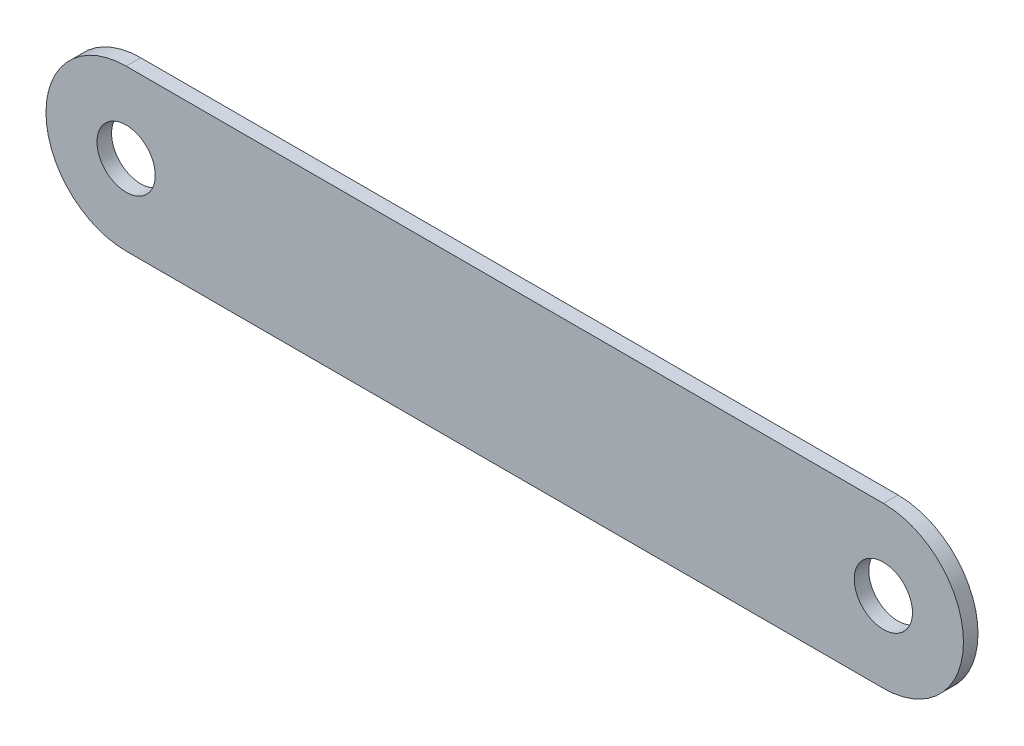
ISO-10303-21;
HEADER;
FILE_DESCRIPTION(('STEP AP214'),'2;1');
FILE_NAME('part.step','',(''),(''),'','','');
FILE_SCHEMA(('AUTOMOTIVE_DESIGN { 1 0 10303 214 1 1 1 1 }'));
ENDSEC;
DATA;
#1=APPLICATION_CONTEXT('core data for automotive mechanical design processes');
#2=APPLICATION_PROTOCOL_DEFINITION('international standard','automotive_design',2000,#1);
#3=PRODUCT_CONTEXT('',#1,'mechanical');
#4=PRODUCT('Part','Part','',(#3));
#5=PRODUCT_RELATED_PRODUCT_CATEGORY('part','',(#4));
#6=PRODUCT_DEFINITION_FORMATION('','',#4);
#7=PRODUCT_DEFINITION_CONTEXT('part definition',#1,'design');
#8=PRODUCT_DEFINITION('design','',#6,#7);
#9=PRODUCT_DEFINITION_SHAPE('','',#8);
#10=(LENGTH_UNIT() NAMED_UNIT(*) SI_UNIT(.MILLI.,.METRE.));
#11=(NAMED_UNIT(*) PLANE_ANGLE_UNIT() SI_UNIT($,.RADIAN.));
#12=(NAMED_UNIT(*) SI_UNIT($,.STERADIAN.) SOLID_ANGLE_UNIT());
#13=UNCERTAINTY_MEASURE_WITH_UNIT(LENGTH_MEASURE(1.E-05),#10,'distance_accuracy_value','');
#14=(GEOMETRIC_REPRESENTATION_CONTEXT(3) GLOBAL_UNCERTAINTY_ASSIGNED_CONTEXT((#13)) GLOBAL_UNIT_ASSIGNED_CONTEXT((#10,
#11,#12)) REPRESENTATION_CONTEXT('',''));
#15=CARTESIAN_POINT('',(0.,0.,0.));
#16=DIRECTION('',(0.,0.,1.));
#17=DIRECTION('',(1.,0.,0.));
#18=AXIS2_PLACEMENT_3D('',#15,#16,#17);
#19=CARTESIAN_POINT('',(0.,0.,1.));
#20=DIRECTION('',(0.,0.,1.));
#21=DIRECTION('',(1.,0.,0.));
#22=AXIS2_PLACEMENT_3D('',#19,#20,#21);
#23=PLANE('',#22);
#24=CARTESIAN_POINT('',(52.,0.,1.));
#25=DIRECTION('',(0.,0.,1.));
#26=DIRECTION('',(1.,0.,0.));
#27=AXIS2_PLACEMENT_3D('',#24,#25,#26);
#28=CIRCLE('',#27,2.);
#29=CARTESIAN_POINT('',(54.,0.,1.));
#30=VERTEX_POINT('',#29);
#31=EDGE_CURVE('E94',#30,#30,#28,.T.);
#32=ORIENTED_EDGE('',*,*,#31,.F.);
#33=EDGE_LOOP('',(#32));
#34=FACE_BOUND('',#33,.T.);
#35=CARTESIAN_POINT('',(0.,0.,1.));
#36=DIRECTION('',(0.,0.,1.));
#37=DIRECTION('',(1.,0.,0.));
#38=AXIS2_PLACEMENT_3D('',#35,#36,#37);
#39=CIRCLE('',#38,5.5);
#40=CARTESIAN_POINT('',(0.,5.5,1.));
#41=VERTEX_POINT('',#40);
#42=CARTESIAN_POINT('',(0.,-5.5,1.));
#43=VERTEX_POINT('',#42);
#44=EDGE_CURVE('E104',#41,#43,#39,.T.);
#45=ORIENTED_EDGE('',*,*,#44,.T.);
#46=DIRECTION('',(1.,0.,0.));
#47=VECTOR('',#46,1.);
#48=CARTESIAN_POINT('',(52.,-5.5,1.));
#49=LINE('',#48,#47);
#50=CARTESIAN_POINT('',(52.,-5.5,1.));
#51=VERTEX_POINT('',#50);
#52=EDGE_CURVE('E89',#43,#51,#49,.T.);
#53=ORIENTED_EDGE('',*,*,#52,.T.);
#54=CARTESIAN_POINT('',(52.,0.,1.));
#55=DIRECTION('',(0.,0.,1.));
#56=DIRECTION('',(1.,0.,0.));
#57=AXIS2_PLACEMENT_3D('',#54,#55,#56);
#58=CIRCLE('',#57,5.5);
#59=CARTESIAN_POINT('',(52.,5.5,1.));
#60=VERTEX_POINT('',#59);
#61=EDGE_CURVE('E55',#51,#60,#58,.T.);
#62=ORIENTED_EDGE('',*,*,#61,.T.);
#63=DIRECTION('',(-1.,0.,0.));
#64=VECTOR('',#63,1.);
#65=CARTESIAN_POINT('',(0.,5.5,1.));
#66=LINE('',#65,#64);
#67=EDGE_CURVE('E50',#60,#41,#66,.T.);
#68=ORIENTED_EDGE('',*,*,#67,.T.);
#69=EDGE_LOOP('',(#45,#53,#62,#68));
#70=FACE_BOUND('',#69,.T.);
#71=CARTESIAN_POINT('',(0.,0.,1.));
#72=DIRECTION('',(0.,0.,1.));
#73=DIRECTION('',(1.,0.,0.));
#74=AXIS2_PLACEMENT_3D('',#71,#72,#73);
#75=CIRCLE('',#74,2.);
#76=CARTESIAN_POINT('',(2.,0.,1.));
#77=VERTEX_POINT('',#76);
#78=EDGE_CURVE('E122',#77,#77,#75,.T.);
#79=ORIENTED_EDGE('',*,*,#78,.F.);
#80=EDGE_LOOP('',(#79));
#81=FACE_BOUND('',#80,.T.);
#82=ADVANCED_FACE('F35',(#34,#70,#81),#23,.T.);
#83=CARTESIAN_POINT('',(0.,0.,0.));
#84=DIRECTION('',(0.,0.,1.));
#85=DIRECTION('',(1.,0.,0.));
#86=AXIS2_PLACEMENT_3D('',#83,#84,#85);
#87=PLANE('',#86);
#88=CARTESIAN_POINT('',(52.,0.,0.));
#89=DIRECTION('',(0.,0.,1.));
#90=DIRECTION('',(1.,0.,0.));
#91=AXIS2_PLACEMENT_3D('',#88,#89,#90);
#92=CIRCLE('',#91,2.);
#93=CARTESIAN_POINT('',(54.,0.,0.));
#94=VERTEX_POINT('',#93);
#95=EDGE_CURVE('E97',#94,#94,#92,.T.);
#96=ORIENTED_EDGE('',*,*,#95,.T.);
#97=EDGE_LOOP('',(#96));
#98=FACE_BOUND('',#97,.T.);
#99=CARTESIAN_POINT('',(0.,0.,0.));
#100=DIRECTION('',(0.,0.,1.));
#101=DIRECTION('',(1.,0.,0.));
#102=AXIS2_PLACEMENT_3D('',#99,#100,#101);
#103=CIRCLE('',#102,5.5);
#104=CARTESIAN_POINT('',(0.,5.5,0.));
#105=VERTEX_POINT('',#104);
#106=CARTESIAN_POINT('',(0.,-5.5,0.));
#107=VERTEX_POINT('',#106);
#108=EDGE_CURVE('E81',#105,#107,#103,.T.);
#109=ORIENTED_EDGE('',*,*,#108,.F.);
#110=DIRECTION('',(-1.,0.,0.));
#111=VECTOR('',#110,1.);
#112=CARTESIAN_POINT('',(0.,5.5,0.));
#113=LINE('',#112,#111);
#114=CARTESIAN_POINT('',(52.,5.5,0.));
#115=VERTEX_POINT('',#114);
#116=EDGE_CURVE('E102',#115,#105,#113,.T.);
#117=ORIENTED_EDGE('',*,*,#116,.F.);
#118=CARTESIAN_POINT('',(52.,0.,0.));
#119=DIRECTION('',(0.,0.,1.));
#120=DIRECTION('',(1.,0.,0.));
#121=AXIS2_PLACEMENT_3D('',#118,#119,#120);
#122=CIRCLE('',#121,5.5);
#123=CARTESIAN_POINT('',(52.,-5.5,0.));
#124=VERTEX_POINT('',#123);
#125=EDGE_CURVE('E82',#124,#115,#122,.T.);
#126=ORIENTED_EDGE('',*,*,#125,.F.);
#127=DIRECTION('',(1.,0.,0.));
#128=VECTOR('',#127,1.);
#129=CARTESIAN_POINT('',(52.,-5.5,0.));
#130=LINE('',#129,#128);
#131=EDGE_CURVE('E76',#107,#124,#130,.T.);
#132=ORIENTED_EDGE('',*,*,#131,.F.);
#133=EDGE_LOOP('',(#109,#117,#126,#132));
#134=FACE_BOUND('',#133,.T.);
#135=CARTESIAN_POINT('',(0.,0.,0.));
#136=DIRECTION('',(0.,0.,1.));
#137=DIRECTION('',(1.,0.,0.));
#138=AXIS2_PLACEMENT_3D('',#135,#136,#137);
#139=CIRCLE('',#138,2.);
#140=CARTESIAN_POINT('',(2.,0.,0.));
#141=VERTEX_POINT('',#140);
#142=EDGE_CURVE('E124',#141,#141,#139,.T.);
#143=ORIENTED_EDGE('',*,*,#142,.T.);
#144=EDGE_LOOP('',(#143));
#145=FACE_BOUND('',#144,.T.);
#146=ADVANCED_FACE('F77',(#98,#134,#145),#87,.F.);
#147=CARTESIAN_POINT('',(0.,0.,1.));
#148=DIRECTION('',(0.,0.,-1.));
#149=DIRECTION('',(-1.,0.,0.));
#150=AXIS2_PLACEMENT_3D('',#147,#148,#149);
#151=CYLINDRICAL_SURFACE('',#150,5.5);
#152=ORIENTED_EDGE('',*,*,#108,.T.);
#153=DIRECTION('',(0.,0.,-1.));
#154=VECTOR('',#153,1.);
#155=CARTESIAN_POINT('',(0.,-5.5,1.));
#156=LINE('',#155,#154);
#157=EDGE_CURVE('E11',#43,#107,#156,.T.);
#158=ORIENTED_EDGE('',*,*,#157,.F.);
#159=ORIENTED_EDGE('',*,*,#44,.F.);
#160=DIRECTION('',(0.,0.,-1.));
#161=VECTOR('',#160,1.);
#162=CARTESIAN_POINT('',(0.,5.5,1.));
#163=LINE('',#162,#161);
#164=EDGE_CURVE('E93',#41,#105,#163,.T.);
#165=ORIENTED_EDGE('',*,*,#164,.T.);
#166=EDGE_LOOP('',(#152,#158,#159,#165));
#167=FACE_BOUND('',#166,.T.);
#168=ADVANCED_FACE('F37',(#167),#151,.T.);
#169=CARTESIAN_POINT('',(52.,-5.5,1.));
#170=DIRECTION('',(0.,1.,0.));
#171=DIRECTION('',(-1.,0.,0.));
#172=AXIS2_PLACEMENT_3D('',#169,#170,#171);
#173=PLANE('',#172);
#174=ORIENTED_EDGE('',*,*,#131,.T.);
#175=DIRECTION('',(0.,0.,-1.));
#176=VECTOR('',#175,1.);
#177=CARTESIAN_POINT('',(52.,-5.5,1.));
#178=LINE('',#177,#176);
#179=EDGE_CURVE('E43',#51,#124,#178,.T.);
#180=ORIENTED_EDGE('',*,*,#179,.F.);
#181=ORIENTED_EDGE('',*,*,#52,.F.);
#182=ORIENTED_EDGE('',*,*,#157,.T.);
#183=EDGE_LOOP('',(#174,#180,#181,#182));
#184=FACE_BOUND('',#183,.T.);
#185=ADVANCED_FACE('F88',(#184),#173,.F.);
#186=CARTESIAN_POINT('',(52.,0.,1.));
#187=DIRECTION('',(0.,0.,-1.));
#188=DIRECTION('',(-1.,0.,0.));
#189=AXIS2_PLACEMENT_3D('',#186,#187,#188);
#190=CYLINDRICAL_SURFACE('',#189,5.5);
#191=ORIENTED_EDGE('',*,*,#125,.T.);
#192=DIRECTION('',(0.,0.,-1.));
#193=VECTOR('',#192,1.);
#194=CARTESIAN_POINT('',(52.,5.5,1.));
#195=LINE('',#194,#193);
#196=EDGE_CURVE('E110',#60,#115,#195,.T.);
#197=ORIENTED_EDGE('',*,*,#196,.F.);
#198=ORIENTED_EDGE('',*,*,#61,.F.);
#199=ORIENTED_EDGE('',*,*,#179,.T.);
#200=EDGE_LOOP('',(#191,#197,#198,#199));
#201=FACE_BOUND('',#200,.T.);
#202=ADVANCED_FACE('F113',(#201),#190,.T.);
#203=CARTESIAN_POINT('',(0.,5.5,1.));
#204=DIRECTION('',(0.,-1.,0.));
#205=DIRECTION('',(1.,0.,0.));
#206=AXIS2_PLACEMENT_3D('',#203,#204,#205);
#207=PLANE('',#206);
#208=ORIENTED_EDGE('',*,*,#116,.T.);
#209=ORIENTED_EDGE('',*,*,#164,.F.);
#210=ORIENTED_EDGE('',*,*,#67,.F.);
#211=ORIENTED_EDGE('',*,*,#196,.T.);
#212=EDGE_LOOP('',(#208,#209,#210,#211));
#213=FACE_BOUND('',#212,.T.);
#214=ADVANCED_FACE('F115',(#213),#207,.F.);
#215=CARTESIAN_POINT('',(52.,0.,1.));
#216=DIRECTION('',(0.,0.,-1.));
#217=DIRECTION('',(-1.,0.,0.));
#218=AXIS2_PLACEMENT_3D('',#215,#216,#217);
#219=CYLINDRICAL_SURFACE('',#218,2.);
#220=ORIENTED_EDGE('',*,*,#31,.T.);
#221=EDGE_LOOP('',(#220));
#222=FACE_BOUND('',#221,.T.);
#223=ORIENTED_EDGE('',*,*,#95,.F.);
#224=EDGE_LOOP('',(#223));
#225=FACE_BOUND('',#224,.T.);
#226=ADVANCED_FACE('F133',(#222,#225),#219,.F.);
#227=CARTESIAN_POINT('',(0.,0.,1.));
#228=DIRECTION('',(0.,0.,-1.));
#229=DIRECTION('',(-1.,0.,0.));
#230=AXIS2_PLACEMENT_3D('',#227,#228,#229);
#231=CYLINDRICAL_SURFACE('',#230,2.);
#232=ORIENTED_EDGE('',*,*,#78,.T.);
#233=EDGE_LOOP('',(#232));
#234=FACE_BOUND('',#233,.T.);
#235=ORIENTED_EDGE('',*,*,#142,.F.);
#236=EDGE_LOOP('',(#235));
#237=FACE_BOUND('',#236,.T.);
#238=ADVANCED_FACE('F131',(#234,#237),#231,.F.);
#239=CLOSED_SHELL('',(#82,#146,#168,#185,#202,#214,#226,#238));
#240=MANIFOLD_SOLID_BREP('B2',#239);
#241=ADVANCED_BREP_SHAPE_REPRESENTATION('',(#18,#240),#14);
#242=SHAPE_DEFINITION_REPRESENTATION(#9,#241);
ENDSEC;
END-ISO-10303-21;
